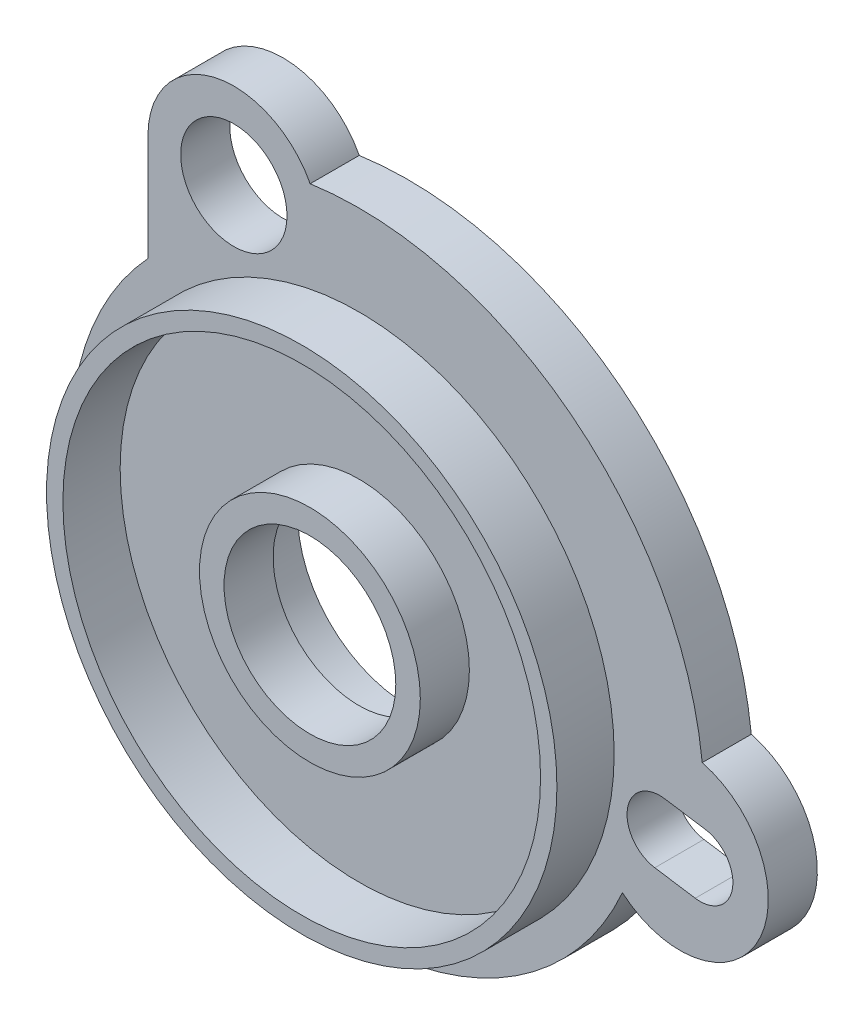
ISO-10303-21;
HEADER;
FILE_DESCRIPTION(('STEP AP214'),'2;1');
FILE_NAME('part.step','',(''),(''),'','','');
FILE_SCHEMA(('AUTOMOTIVE_DESIGN { 1 0 10303 214 1 1 1 1 }'));
ENDSEC;
DATA;
#1=APPLICATION_CONTEXT('core data for automotive mechanical design processes');
#2=APPLICATION_PROTOCOL_DEFINITION('international standard','automotive_design',2000,#1);
#3=PRODUCT_CONTEXT('',#1,'mechanical');
#4=PRODUCT('Part','Part','',(#3));
#5=PRODUCT_RELATED_PRODUCT_CATEGORY('part','',(#4));
#6=PRODUCT_DEFINITION_FORMATION('','',#4);
#7=PRODUCT_DEFINITION_CONTEXT('part definition',#1,'design');
#8=PRODUCT_DEFINITION('design','',#6,#7);
#9=PRODUCT_DEFINITION_SHAPE('','',#8);
#10=(LENGTH_UNIT() NAMED_UNIT(*) SI_UNIT(.MILLI.,.METRE.));
#11=(NAMED_UNIT(*) PLANE_ANGLE_UNIT() SI_UNIT($,.RADIAN.));
#12=(NAMED_UNIT(*) SI_UNIT($,.STERADIAN.) SOLID_ANGLE_UNIT());
#13=UNCERTAINTY_MEASURE_WITH_UNIT(LENGTH_MEASURE(1.E-05),#10,'distance_accuracy_value','');
#14=(GEOMETRIC_REPRESENTATION_CONTEXT(3) GLOBAL_UNCERTAINTY_ASSIGNED_CONTEXT((#13)) GLOBAL_UNIT_ASSIGNED_CONTEXT((#10,
#11,#12)) REPRESENTATION_CONTEXT('',''));
#15=CARTESIAN_POINT('',(0.,0.,0.));
#16=DIRECTION('',(0.,0.,1.));
#17=DIRECTION('',(1.,0.,0.));
#18=AXIS2_PLACEMENT_3D('',#15,#16,#17);
#19=CARTESIAN_POINT('',(18.3863485138619,-2.81108312342569,-3.));
#20=DIRECTION('',(0.,0.,1.));
#21=DIRECTION('',(1.,0.,0.));
#22=AXIS2_PLACEMENT_3D('',#19,#20,#21);
#23=CYLINDRICAL_SURFACE('',#22,2.);
#24=CARTESIAN_POINT('',(18.3863485138619,-2.81108312342569,0.));
#25=DIRECTION('',(0.,0.,1.));
#26=DIRECTION('',(1.,0.,0.));
#27=AXIS2_PLACEMENT_3D('',#24,#25,#26);
#28=CIRCLE('',#27,2.);
#29=CARTESIAN_POINT('',(18.6886155163808,-0.83405640150506,0.));
#30=VERTEX_POINT('',#29);
#31=CARTESIAN_POINT('',(18.084081511343,-4.78810984534632,0.));
#32=VERTEX_POINT('',#31);
#33=EDGE_CURVE('E175',#30,#32,#28,.T.);
#34=ORIENTED_EDGE('',*,*,#33,.T.);
#35=DIRECTION('',(0.,0.,1.));
#36=VECTOR('',#35,1.);
#37=CARTESIAN_POINT('',(18.084081511343,-4.78810984534632,-3.));
#38=LINE('',#37,#36);
#39=CARTESIAN_POINT('',(18.084081511343,-4.78810984534632,-3.));
#40=VERTEX_POINT('',#39);
#41=EDGE_CURVE('E12',#40,#32,#38,.T.);
#42=ORIENTED_EDGE('',*,*,#41,.F.);
#43=CARTESIAN_POINT('',(18.3863485138619,-2.81108312342569,-3.));
#44=DIRECTION('',(0.,0.,1.));
#45=DIRECTION('',(1.,0.,0.));
#46=AXIS2_PLACEMENT_3D('',#43,#44,#45);
#47=CIRCLE('',#46,2.);
#48=CARTESIAN_POINT('',(18.6886155163808,-0.83405640150506,-3.));
#49=VERTEX_POINT('',#48);
#50=EDGE_CURVE('E147',#49,#40,#47,.T.);
#51=ORIENTED_EDGE('',*,*,#50,.F.);
#52=DIRECTION('',(0.,0.,1.));
#53=VECTOR('',#52,1.);
#54=CARTESIAN_POINT('',(18.6886155163808,-0.83405640150506,-3.));
#55=LINE('',#54,#53);
#56=EDGE_CURVE('E143',#49,#30,#55,.T.);
#57=ORIENTED_EDGE('',*,*,#56,.T.);
#58=EDGE_LOOP('',(#34,#42,#51,#57));
#59=FACE_BOUND('',#58,.T.);
#60=ADVANCED_FACE('F50',(#59),#23,.F.);
#61=CARTESIAN_POINT('',(-0.302267002518891,-1.97702672192062,-3.));
#62=DIRECTION('',(-0.151133501259446,-0.988513360960317,0.));
#63=DIRECTION('',(0.988513360960317,-0.151133501259446,0.));
#64=AXIS2_PLACEMENT_3D('',#61,#62,#63);
#65=PLANE('',#64);
#66=DIRECTION('',(0.988513360960317,-0.151133501259446,0.));
#67=VECTOR('',#66,1.);
#68=CARTESIAN_POINT('',(-0.302267002518891,-1.97702672192062,0.));
#69=LINE('',#68,#67);
#70=CARTESIAN_POINT('',(20.5553649137438,-5.16594359849494,0.));
#71=VERTEX_POINT('',#70);
#72=EDGE_CURVE('E97',#32,#71,#69,.T.);
#73=ORIENTED_EDGE('',*,*,#72,.T.);
#74=DIRECTION('',(0.,0.,1.));
#75=VECTOR('',#74,1.);
#76=CARTESIAN_POINT('',(20.5553649137438,-5.16594359849494,-3.));
#77=LINE('',#76,#75);
#78=CARTESIAN_POINT('',(20.5553649137438,-5.16594359849494,-3.));
#79=VERTEX_POINT('',#78);
#80=EDGE_CURVE('E60',#79,#71,#77,.T.);
#81=ORIENTED_EDGE('',*,*,#80,.F.);
#82=DIRECTION('',(0.988513360960317,-0.151133501259446,0.));
#83=VECTOR('',#82,1.);
#84=CARTESIAN_POINT('',(-0.302267002518891,-1.97702672192062,-3.));
#85=LINE('',#84,#83);
#86=EDGE_CURVE('E68',#40,#79,#85,.T.);
#87=ORIENTED_EDGE('',*,*,#86,.F.);
#88=ORIENTED_EDGE('',*,*,#41,.T.);
#89=EDGE_LOOP('',(#73,#81,#87,#88));
#90=FACE_BOUND('',#89,.T.);
#91=ADVANCED_FACE('F249',(#90),#65,.F.);
#92=CARTESIAN_POINT('',(20.8576319162627,-3.18891687657431,-3.));
#93=DIRECTION('',(0.,0.,1.));
#94=DIRECTION('',(1.,0.,0.));
#95=AXIS2_PLACEMENT_3D('',#92,#93,#94);
#96=CYLINDRICAL_SURFACE('',#95,2.);
#97=CARTESIAN_POINT('',(20.8576319162627,-3.18891687657431,0.));
#98=DIRECTION('',(0.,0.,1.));
#99=DIRECTION('',(1.,0.,0.));
#100=AXIS2_PLACEMENT_3D('',#97,#98,#99);
#101=CIRCLE('',#100,2.);
#102=CARTESIAN_POINT('',(21.1598989187816,-1.21189015465367,0.));
#103=VERTEX_POINT('',#102);
#104=EDGE_CURVE('E139',#71,#103,#101,.T.);
#105=ORIENTED_EDGE('',*,*,#104,.T.);
#106=DIRECTION('',(0.,0.,1.));
#107=VECTOR('',#106,1.);
#108=CARTESIAN_POINT('',(21.1598989187816,-1.21189015465367,-3.));
#109=LINE('',#108,#107);
#110=CARTESIAN_POINT('',(21.1598989187816,-1.21189015465367,-3.));
#111=VERTEX_POINT('',#110);
#112=EDGE_CURVE('E137',#111,#103,#109,.T.);
#113=ORIENTED_EDGE('',*,*,#112,.F.);
#114=CARTESIAN_POINT('',(20.8576319162627,-3.18891687657431,-3.));
#115=DIRECTION('',(0.,0.,1.));
#116=DIRECTION('',(1.,0.,0.));
#117=AXIS2_PLACEMENT_3D('',#114,#115,#116);
#118=CIRCLE('',#117,2.);
#119=EDGE_CURVE('E128',#79,#111,#118,.T.);
#120=ORIENTED_EDGE('',*,*,#119,.F.);
#121=ORIENTED_EDGE('',*,*,#80,.T.);
#122=EDGE_LOOP('',(#105,#113,#120,#121));
#123=FACE_BOUND('',#122,.T.);
#124=ADVANCED_FACE('F138',(#123),#96,.F.);
#125=CARTESIAN_POINT('',(0.,0.,-3.));
#126=DIRECTION('',(0.,0.,1.));
#127=DIRECTION('',(1.,0.,0.));
#128=AXIS2_PLACEMENT_3D('',#125,#126,#127);
#129=CYLINDRICAL_SURFACE('',#128,17.6);
#130=CARTESIAN_POINT('',(0.,0.,0.));
#131=DIRECTION('',(0.,0.,1.));
#132=DIRECTION('',(1.,0.,0.));
#133=AXIS2_PLACEMENT_3D('',#130,#131,#132);
#134=CIRCLE('',#133,17.6);
#135=CARTESIAN_POINT('',(-12.9,11.9728860347036,0.));
#136=VERTEX_POINT('',#135);
#137=CARTESIAN_POINT('',(16.1052762288819,-7.09789247533454,0.));
#138=VERTEX_POINT('',#137);
#139=EDGE_CURVE('E157',#136,#138,#134,.T.);
#140=ORIENTED_EDGE('',*,*,#139,.F.);
#141=DIRECTION('',(0.,0.,1.));
#142=VECTOR('',#141,1.);
#143=CARTESIAN_POINT('',(-12.9,11.9728860347036,-3.));
#144=LINE('',#143,#142);
#145=CARTESIAN_POINT('',(-12.9,11.9728860347036,-3.));
#146=VERTEX_POINT('',#145);
#147=EDGE_CURVE('E188',#146,#136,#144,.T.);
#148=ORIENTED_EDGE('',*,*,#147,.F.);
#149=CARTESIAN_POINT('',(0.,0.,-3.));
#150=DIRECTION('',(0.,0.,1.));
#151=DIRECTION('',(1.,0.,0.));
#152=AXIS2_PLACEMENT_3D('',#149,#150,#151);
#153=CIRCLE('',#152,17.6);
#154=CARTESIAN_POINT('',(16.1052762288819,-7.09789247533454,-3.));
#155=VERTEX_POINT('',#154);
#156=EDGE_CURVE('E184',#146,#155,#153,.T.);
#157=ORIENTED_EDGE('',*,*,#156,.T.);
#158=DIRECTION('',(0.,0.,1.));
#159=VECTOR('',#158,1.);
#160=CARTESIAN_POINT('',(16.1052762288819,-7.09789247533454,-3.));
#161=LINE('',#160,#159);
#162=EDGE_CURVE('E54',#155,#138,#161,.T.);
#163=ORIENTED_EDGE('',*,*,#162,.T.);
#164=EDGE_LOOP('',(#140,#148,#157,#163));
#165=FACE_BOUND('',#164,.T.);
#166=ADVANCED_FACE('F52',(#165),#129,.T.);
#167=CARTESIAN_POINT('',(-12.9,0.,-3.));
#168=DIRECTION('',(1.,0.,0.));
#169=DIRECTION('',(0.,1.,0.));
#170=AXIS2_PLACEMENT_3D('',#167,#168,#169);
#171=PLANE('',#170);
#172=DIRECTION('',(0.,1.,0.));
#173=VECTOR('',#172,1.);
#174=CARTESIAN_POINT('',(-12.9,0.,0.));
#175=LINE('',#174,#173);
#176=CARTESIAN_POINT('',(-12.9,18.4791098270452,0.));
#177=VERTEX_POINT('',#176);
#178=EDGE_CURVE('E169',#136,#177,#175,.T.);
#179=ORIENTED_EDGE('',*,*,#178,.T.);
#180=DIRECTION('',(0.,0.,1.));
#181=VECTOR('',#180,1.);
#182=CARTESIAN_POINT('',(-12.9,18.4791098270452,-3.));
#183=LINE('',#182,#181);
#184=CARTESIAN_POINT('',(-12.9,18.4791098270452,-3.));
#185=VERTEX_POINT('',#184);
#186=EDGE_CURVE('E190',#185,#177,#183,.T.);
#187=ORIENTED_EDGE('',*,*,#186,.F.);
#188=DIRECTION('',(0.,1.,0.));
#189=VECTOR('',#188,1.);
#190=CARTESIAN_POINT('',(-12.9,0.,-3.));
#191=LINE('',#190,#189);
#192=EDGE_CURVE('E210',#146,#185,#191,.T.);
#193=ORIENTED_EDGE('',*,*,#192,.F.);
#194=ORIENTED_EDGE('',*,*,#147,.T.);
#195=EDGE_LOOP('',(#179,#187,#193,#194));
#196=FACE_BOUND('',#195,.T.);
#197=ADVANCED_FACE('F207',(#196),#171,.F.);
#198=CARTESIAN_POINT('',(-7.65,18.4791098270452,-3.));
#199=DIRECTION('',(0.,0.,1.));
#200=DIRECTION('',(1.,0.,0.));
#201=AXIS2_PLACEMENT_3D('',#198,#199,#200);
#202=CYLINDRICAL_SURFACE('',#201,5.25);
#203=CARTESIAN_POINT('',(-7.65,18.4791098270452,0.));
#204=DIRECTION('',(0.,0.,1.));
#205=DIRECTION('',(1.,0.,0.));
#206=AXIS2_PLACEMENT_3D('',#203,#204,#205);
#207=CIRCLE('',#206,5.25);
#208=CARTESIAN_POINT('',(-2.98514629499739,20.8877691867147,0.));
#209=VERTEX_POINT('',#208);
#210=EDGE_CURVE('E166',#209,#177,#207,.T.);
#211=ORIENTED_EDGE('',*,*,#210,.F.);
#212=DIRECTION('',(0.,0.,1.));
#213=VECTOR('',#212,1.);
#214=CARTESIAN_POINT('',(-2.98514629499739,20.8877691867147,-3.));
#215=LINE('',#214,#213);
#216=CARTESIAN_POINT('',(-2.98514629499739,20.8877691867147,-3.));
#217=VERTEX_POINT('',#216);
#218=EDGE_CURVE('E192',#217,#209,#215,.T.);
#219=ORIENTED_EDGE('',*,*,#218,.F.);
#220=CARTESIAN_POINT('',(-7.65,18.4791098270452,-3.));
#221=DIRECTION('',(0.,0.,1.));
#222=DIRECTION('',(1.,0.,0.));
#223=AXIS2_PLACEMENT_3D('',#220,#221,#222);
#224=CIRCLE('',#223,5.25);
#225=EDGE_CURVE('E213',#217,#185,#224,.T.);
#226=ORIENTED_EDGE('',*,*,#225,.T.);
#227=ORIENTED_EDGE('',*,*,#186,.T.);
#228=EDGE_LOOP('',(#211,#219,#226,#227));
#229=FACE_BOUND('',#228,.T.);
#230=ADVANCED_FACE('F260',(#229),#202,.T.);
#231=CARTESIAN_POINT('',(3.05311331771918E-13,1.80411241501588E-13,-3.));
#232=DIRECTION('',(0.,0.,1.));
#233=DIRECTION('',(1.,0.,0.));
#234=AXIS2_PLACEMENT_3D('',#231,#232,#233);
#235=CYLINDRICAL_SURFACE('',#234,21.1);
#236=CARTESIAN_POINT('',(3.05311331771918E-13,1.80411241501588E-13,0.));
#237=DIRECTION('',(0.,0.,1.));
#238=DIRECTION('',(1.,0.,0.));
#239=AXIS2_PLACEMENT_3D('',#236,#237,#238);
#240=CIRCLE('',#239,21.1);
#241=CARTESIAN_POINT('',(20.982267102422,2.22586325784697,0.));
#242=VERTEX_POINT('',#241);
#243=EDGE_CURVE('E163',#242,#209,#240,.T.);
#244=ORIENTED_EDGE('',*,*,#243,.F.);
#245=DIRECTION('',(0.,0.,1.));
#246=VECTOR('',#245,1.);
#247=CARTESIAN_POINT('',(20.982267102422,2.22586325784697,-3.));
#248=LINE('',#247,#246);
#249=CARTESIAN_POINT('',(20.982267102422,2.22586325784697,-3.));
#250=VERTEX_POINT('',#249);
#251=EDGE_CURVE('E193',#250,#242,#248,.T.);
#252=ORIENTED_EDGE('',*,*,#251,.F.);
#253=CARTESIAN_POINT('',(3.05311331771918E-13,1.80411241501588E-13,-3.));
#254=DIRECTION('',(0.,0.,1.));
#255=DIRECTION('',(1.,0.,0.));
#256=AXIS2_PLACEMENT_3D('',#253,#254,#255);
#257=CIRCLE('',#256,21.1);
#258=EDGE_CURVE('E219',#250,#217,#257,.T.);
#259=ORIENTED_EDGE('',*,*,#258,.T.);
#260=ORIENTED_EDGE('',*,*,#218,.T.);
#261=EDGE_LOOP('',(#244,#252,#259,#260));
#262=FACE_BOUND('',#261,.T.);
#263=ADVANCED_FACE('F263',(#262),#235,.T.);
#264=CARTESIAN_POINT('',(0.302267002518889,1.97702672192062,-3.));
#265=DIRECTION('',(-0.151133501259445,-0.988513360960317,0.));
#266=DIRECTION('',(0.988513360960317,-0.151133501259445,0.));
#267=AXIS2_PLACEMENT_3D('',#264,#265,#266);
#268=PLANE('',#267);
#269=DIRECTION('',(0.988513360960317,-0.151133501259445,0.));
#270=VECTOR('',#269,1.);
#271=CARTESIAN_POINT('',(0.302267002518889,1.97702672192062,0.));
#272=LINE('',#271,#270);
#273=EDGE_CURVE('E178',#30,#103,#272,.T.);
#274=ORIENTED_EDGE('',*,*,#273,.F.);
#275=ORIENTED_EDGE('',*,*,#56,.F.);
#276=DIRECTION('',(0.988513360960317,-0.151133501259445,0.));
#277=VECTOR('',#276,1.);
#278=CARTESIAN_POINT('',(0.302267002518889,1.97702672192062,-3.));
#279=LINE('',#278,#277);
#280=EDGE_CURVE('E133',#49,#111,#279,.T.);
#281=ORIENTED_EDGE('',*,*,#280,.T.);
#282=ORIENTED_EDGE('',*,*,#112,.T.);
#283=EDGE_LOOP('',(#274,#275,#281,#282));
#284=FACE_BOUND('',#283,.T.);
#285=ADVANCED_FACE('F145',(#284),#268,.T.);
#286=CARTESIAN_POINT('',(-7.65,18.4791098270452,-3.));
#287=DIRECTION('',(0.,0.,1.));
#288=DIRECTION('',(1.,0.,0.));
#289=AXIS2_PLACEMENT_3D('',#286,#287,#288);
#290=CYLINDRICAL_SURFACE('',#289,3.25);
#291=CARTESIAN_POINT('',(-7.65,18.4791098270452,-3.));
#292=DIRECTION('',(0.,0.,1.));
#293=DIRECTION('',(1.,0.,0.));
#294=AXIS2_PLACEMENT_3D('',#291,#292,#293);
#295=CIRCLE('',#294,3.25);
#296=CARTESIAN_POINT('',(-4.4,18.4791098270452,-3.));
#297=VERTEX_POINT('',#296);
#298=EDGE_CURVE('E149',#297,#297,#295,.T.);
#299=ORIENTED_EDGE('',*,*,#298,.F.);
#300=EDGE_LOOP('',(#299));
#301=FACE_BOUND('',#300,.T.);
#302=CARTESIAN_POINT('',(-7.65,18.4791098270452,0.));
#303=DIRECTION('',(0.,0.,1.));
#304=DIRECTION('',(1.,0.,0.));
#305=AXIS2_PLACEMENT_3D('',#302,#303,#304);
#306=CIRCLE('',#305,3.25);
#307=CARTESIAN_POINT('',(-4.4,18.4791098270452,0.));
#308=VERTEX_POINT('',#307);
#309=EDGE_CURVE('E172',#308,#308,#306,.T.);
#310=ORIENTED_EDGE('',*,*,#309,.T.);
#311=EDGE_LOOP('',(#310));
#312=FACE_BOUND('',#311,.T.);
#313=ADVANCED_FACE('F227',(#301,#312),#290,.F.);
#314=CARTESIAN_POINT('',(19.6219902150623,-3.,-3.));
#315=DIRECTION('',(0.,0.,1.));
#316=DIRECTION('',(1.,0.,0.));
#317=AXIS2_PLACEMENT_3D('',#314,#315,#316);
#318=CYLINDRICAL_SURFACE('',#317,5.4);
#319=CARTESIAN_POINT('',(19.6219902150623,-3.,0.));
#320=DIRECTION('',(0.,0.,1.));
#321=DIRECTION('',(1.,0.,0.));
#322=AXIS2_PLACEMENT_3D('',#319,#320,#321);
#323=CIRCLE('',#322,5.4);
#324=EDGE_CURVE('E160',#138,#242,#323,.T.);
#325=ORIENTED_EDGE('',*,*,#324,.F.);
#326=ORIENTED_EDGE('',*,*,#162,.F.);
#327=CARTESIAN_POINT('',(19.6219902150623,-3.,-3.));
#328=DIRECTION('',(0.,0.,1.));
#329=DIRECTION('',(1.,0.,0.));
#330=AXIS2_PLACEMENT_3D('',#327,#328,#329);
#331=CIRCLE('',#330,5.4);
#332=EDGE_CURVE('E217',#155,#250,#331,.T.);
#333=ORIENTED_EDGE('',*,*,#332,.T.);
#334=ORIENTED_EDGE('',*,*,#251,.T.);
#335=EDGE_LOOP('',(#325,#326,#333,#334));
#336=FACE_BOUND('',#335,.T.);
#337=ADVANCED_FACE('F199',(#336),#318,.T.);
#338=CARTESIAN_POINT('',(0.,0.,-3.));
#339=DIRECTION('',(0.,0.,1.));
#340=DIRECTION('',(1.,0.,0.));
#341=AXIS2_PLACEMENT_3D('',#338,#339,#340);
#342=CYLINDRICAL_SURFACE('',#341,6.75);
#343=CARTESIAN_POINT('',(0.,0.,-3.));
#344=DIRECTION('',(0.,0.,1.));
#345=DIRECTION('',(1.,0.,0.));
#346=AXIS2_PLACEMENT_3D('',#343,#344,#345);
#347=CIRCLE('',#346,6.75);
#348=CARTESIAN_POINT('',(6.75,0.,-3.));
#349=VERTEX_POINT('',#348);
#350=EDGE_CURVE('E154',#349,#349,#347,.T.);
#351=ORIENTED_EDGE('',*,*,#350,.F.);
#352=EDGE_LOOP('',(#351));
#353=FACE_BOUND('',#352,.T.);
#354=CARTESIAN_POINT('',(0.,0.,0.));
#355=DIRECTION('',(0.,0.,1.));
#356=DIRECTION('',(1.,0.,0.));
#357=AXIS2_PLACEMENT_3D('',#354,#355,#356);
#358=CIRCLE('',#357,6.75);
#359=CARTESIAN_POINT('',(6.75,0.,0.));
#360=VERTEX_POINT('',#359);
#361=EDGE_CURVE('E182',#360,#360,#358,.T.);
#362=ORIENTED_EDGE('',*,*,#361,.T.);
#363=EDGE_LOOP('',(#362));
#364=FACE_BOUND('',#363,.T.);
#365=ADVANCED_FACE('F237',(#353,#364),#342,.F.);
#366=CARTESIAN_POINT('',(0.,0.,-3.));
#367=DIRECTION('',(0.,0.,1.));
#368=DIRECTION('',(1.,0.,0.));
#369=AXIS2_PLACEMENT_3D('',#366,#367,#368);
#370=PLANE('',#369);
#371=ORIENTED_EDGE('',*,*,#156,.F.);
#372=ORIENTED_EDGE('',*,*,#192,.T.);
#373=ORIENTED_EDGE('',*,*,#225,.F.);
#374=ORIENTED_EDGE('',*,*,#258,.F.);
#375=ORIENTED_EDGE('',*,*,#332,.F.);
#376=EDGE_LOOP('',(#371,#372,#373,#374,#375));
#377=FACE_BOUND('',#376,.T.);
#378=ORIENTED_EDGE('',*,*,#298,.T.);
#379=EDGE_LOOP('',(#378));
#380=FACE_BOUND('',#379,.T.);
#381=ORIENTED_EDGE('',*,*,#50,.T.);
#382=ORIENTED_EDGE('',*,*,#86,.T.);
#383=ORIENTED_EDGE('',*,*,#119,.T.);
#384=ORIENTED_EDGE('',*,*,#280,.F.);
#385=EDGE_LOOP('',(#381,#382,#383,#384));
#386=FACE_BOUND('',#385,.T.);
#387=ORIENTED_EDGE('',*,*,#350,.T.);
#388=EDGE_LOOP('',(#387));
#389=FACE_BOUND('',#388,.T.);
#390=ADVANCED_FACE('F130',(#377,#380,#386,#389),#370,.F.);
#391=CARTESIAN_POINT('',(0.,0.,0.));
#392=DIRECTION('',(0.,0.,1.));
#393=DIRECTION('',(1.,0.,0.));
#394=AXIS2_PLACEMENT_3D('',#391,#392,#393);
#395=PLANE('',#394);
#396=ORIENTED_EDGE('',*,*,#139,.T.);
#397=ORIENTED_EDGE('',*,*,#324,.T.);
#398=ORIENTED_EDGE('',*,*,#243,.T.);
#399=ORIENTED_EDGE('',*,*,#210,.T.);
#400=ORIENTED_EDGE('',*,*,#178,.F.);
#401=EDGE_LOOP('',(#396,#397,#398,#399,#400));
#402=FACE_BOUND('',#401,.T.);
#403=ORIENTED_EDGE('',*,*,#309,.F.);
#404=EDGE_LOOP('',(#403));
#405=FACE_BOUND('',#404,.T.);
#406=ORIENTED_EDGE('',*,*,#33,.F.);
#407=ORIENTED_EDGE('',*,*,#273,.T.);
#408=ORIENTED_EDGE('',*,*,#104,.F.);
#409=ORIENTED_EDGE('',*,*,#72,.F.);
#410=EDGE_LOOP('',(#406,#407,#408,#409));
#411=FACE_BOUND('',#410,.T.);
#412=ORIENTED_EDGE('',*,*,#361,.F.);
#413=EDGE_LOOP('',(#412));
#414=FACE_BOUND('',#413,.T.);
#415=ADVANCED_FACE('F202',(#402,#405,#411,#414),#395,.T.);
#416=CLOSED_SHELL('',(#60,#91,#124,#166,#197,#230,#263,#285,#313,#337,#365,#390,#415));
#417=MANIFOLD_SOLID_BREP('B2',#416);
#418=CARTESIAN_POINT('',(0.,0.,3.));
#419=DIRECTION('',(0.,0.,-1.));
#420=DIRECTION('',(-1.,0.,0.));
#421=AXIS2_PLACEMENT_3D('',#418,#419,#420);
#422=CYLINDRICAL_SURFACE('',#421,5.25);
#423=CARTESIAN_POINT('',(0.,0.,3.));
#424=DIRECTION('',(0.,0.,1.));
#425=DIRECTION('',(1.,0.,0.));
#426=AXIS2_PLACEMENT_3D('',#423,#424,#425);
#427=CIRCLE('',#426,5.25);
#428=CARTESIAN_POINT('',(5.25,0.,3.));
#429=VERTEX_POINT('',#428);
#430=EDGE_CURVE('E376',#429,#429,#427,.T.);
#431=ORIENTED_EDGE('',*,*,#430,.T.);
#432=EDGE_LOOP('',(#431));
#433=FACE_BOUND('',#432,.T.);
#434=CARTESIAN_POINT('',(0.,0.,0.));
#435=DIRECTION('',(0.,0.,1.));
#436=DIRECTION('',(1.,0.,0.));
#437=AXIS2_PLACEMENT_3D('',#434,#435,#436);
#438=CIRCLE('',#437,5.25);
#439=CARTESIAN_POINT('',(5.25,0.,0.));
#440=VERTEX_POINT('',#439);
#441=EDGE_CURVE('E382',#440,#440,#438,.T.);
#442=ORIENTED_EDGE('',*,*,#441,.F.);
#443=EDGE_LOOP('',(#442));
#444=FACE_BOUND('',#443,.T.);
#445=ADVANCED_FACE('F369',(#433,#444),#422,.F.);
#446=CARTESIAN_POINT('',(0.,0.,3.));
#447=DIRECTION('',(0.,0.,-1.));
#448=DIRECTION('',(-1.,0.,0.));
#449=AXIS2_PLACEMENT_3D('',#446,#447,#448);
#450=CYLINDRICAL_SURFACE('',#449,6.75);
#451=CARTESIAN_POINT('',(0.,0.,3.));
#452=DIRECTION('',(0.,0.,1.));
#453=DIRECTION('',(1.,0.,0.));
#454=AXIS2_PLACEMENT_3D('',#451,#452,#453);
#455=CIRCLE('',#454,6.75);
#456=CARTESIAN_POINT('',(6.75,0.,3.));
#457=VERTEX_POINT('',#456);
#458=EDGE_CURVE('E49',#457,#457,#455,.T.);
#459=ORIENTED_EDGE('',*,*,#458,.F.);
#460=EDGE_LOOP('',(#459));
#461=FACE_BOUND('',#460,.T.);
#462=CARTESIAN_POINT('',(0.,0.,0.));
#463=DIRECTION('',(0.,0.,1.));
#464=DIRECTION('',(1.,0.,0.));
#465=AXIS2_PLACEMENT_3D('',#462,#463,#464);
#466=CIRCLE('',#465,6.75);
#467=CARTESIAN_POINT('',(6.75,0.,0.));
#468=VERTEX_POINT('',#467);
#469=EDGE_CURVE('E372',#468,#468,#466,.T.);
#470=ORIENTED_EDGE('',*,*,#469,.T.);
#471=EDGE_LOOP('',(#470));
#472=FACE_BOUND('',#471,.T.);
#473=ADVANCED_FACE('F389',(#461,#472),#450,.T.);
#474=CARTESIAN_POINT('',(0.,0.,3.));
#475=DIRECTION('',(0.,0.,1.));
#476=DIRECTION('',(1.,0.,0.));
#477=AXIS2_PLACEMENT_3D('',#474,#475,#476);
#478=PLANE('',#477);
#479=ORIENTED_EDGE('',*,*,#430,.F.);
#480=EDGE_LOOP('',(#479));
#481=FACE_BOUND('',#480,.T.);
#482=ORIENTED_EDGE('',*,*,#458,.T.);
#483=EDGE_LOOP('',(#482));
#484=FACE_BOUND('',#483,.T.);
#485=ADVANCED_FACE('F393',(#481,#484),#478,.T.);
#486=CARTESIAN_POINT('',(0.,0.,0.));
#487=DIRECTION('',(0.,0.,1.));
#488=DIRECTION('',(1.,0.,0.));
#489=AXIS2_PLACEMENT_3D('',#486,#487,#488);
#490=PLANE('',#489);
#491=ORIENTED_EDGE('',*,*,#441,.T.);
#492=EDGE_LOOP('',(#491));
#493=FACE_BOUND('',#492,.T.);
#494=ORIENTED_EDGE('',*,*,#469,.F.);
#495=EDGE_LOOP('',(#494));
#496=FACE_BOUND('',#495,.T.);
#497=ADVANCED_FACE('F391',(#493,#496),#490,.F.);
#498=CLOSED_SHELL('',(#445,#473,#485,#497));
#499=MANIFOLD_SOLID_BREP('B6',#498);
#500=CARTESIAN_POINT('',(0.,0.,3.5));
#501=DIRECTION('',(0.,0.,-1.));
#502=DIRECTION('',(-1.,0.,0.));
#503=AXIS2_PLACEMENT_3D('',#500,#501,#502);
#504=CYLINDRICAL_SURFACE('',#503,14.6);
#505=CARTESIAN_POINT('',(0.,0.,3.5));
#506=DIRECTION('',(0.,0.,1.));
#507=DIRECTION('',(1.,0.,0.));
#508=AXIS2_PLACEMENT_3D('',#505,#506,#507);
#509=CIRCLE('',#508,14.6);
#510=CARTESIAN_POINT('',(14.6,0.,3.5));
#511=VERTEX_POINT('',#510);
#512=EDGE_CURVE('E440',#511,#511,#509,.T.);
#513=ORIENTED_EDGE('',*,*,#512,.T.);
#514=EDGE_LOOP('',(#513));
#515=FACE_BOUND('',#514,.T.);
#516=CARTESIAN_POINT('',(0.,0.,0.));
#517=DIRECTION('',(0.,0.,1.));
#518=DIRECTION('',(1.,0.,0.));
#519=AXIS2_PLACEMENT_3D('',#516,#517,#518);
#520=CIRCLE('',#519,14.6);
#521=CARTESIAN_POINT('',(14.6,0.,0.));
#522=VERTEX_POINT('',#521);
#523=EDGE_CURVE('E446',#522,#522,#520,.T.);
#524=ORIENTED_EDGE('',*,*,#523,.F.);
#525=EDGE_LOOP('',(#524));
#526=FACE_BOUND('',#525,.T.);
#527=ADVANCED_FACE('F433',(#515,#526),#504,.F.);
#528=CARTESIAN_POINT('',(0.,0.,3.5));
#529=DIRECTION('',(0.,0.,-1.));
#530=DIRECTION('',(-1.,0.,0.));
#531=AXIS2_PLACEMENT_3D('',#528,#529,#530);
#532=CYLINDRICAL_SURFACE('',#531,15.6);
#533=CARTESIAN_POINT('',(0.,0.,3.5));
#534=DIRECTION('',(0.,0.,1.));
#535=DIRECTION('',(1.,0.,0.));
#536=AXIS2_PLACEMENT_3D('',#533,#534,#535);
#537=CIRCLE('',#536,15.6);
#538=CARTESIAN_POINT('',(15.6,0.,3.5));
#539=VERTEX_POINT('',#538);
#540=EDGE_CURVE('E368',#539,#539,#537,.T.);
#541=ORIENTED_EDGE('',*,*,#540,.F.);
#542=EDGE_LOOP('',(#541));
#543=FACE_BOUND('',#542,.T.);
#544=CARTESIAN_POINT('',(0.,0.,0.));
#545=DIRECTION('',(0.,0.,1.));
#546=DIRECTION('',(1.,0.,0.));
#547=AXIS2_PLACEMENT_3D('',#544,#545,#546);
#548=CIRCLE('',#547,15.6);
#549=CARTESIAN_POINT('',(15.6,0.,0.));
#550=VERTEX_POINT('',#549);
#551=EDGE_CURVE('E436',#550,#550,#548,.T.);
#552=ORIENTED_EDGE('',*,*,#551,.T.);
#553=EDGE_LOOP('',(#552));
#554=FACE_BOUND('',#553,.T.);
#555=ADVANCED_FACE('F453',(#543,#554),#532,.T.);
#556=CARTESIAN_POINT('',(0.,0.,3.5));
#557=DIRECTION('',(0.,0.,1.));
#558=DIRECTION('',(1.,0.,0.));
#559=AXIS2_PLACEMENT_3D('',#556,#557,#558);
#560=PLANE('',#559);
#561=ORIENTED_EDGE('',*,*,#512,.F.);
#562=EDGE_LOOP('',(#561));
#563=FACE_BOUND('',#562,.T.);
#564=ORIENTED_EDGE('',*,*,#540,.T.);
#565=EDGE_LOOP('',(#564));
#566=FACE_BOUND('',#565,.T.);
#567=ADVANCED_FACE('F457',(#563,#566),#560,.T.);
#568=CARTESIAN_POINT('',(0.,0.,0.));
#569=DIRECTION('',(0.,0.,1.));
#570=DIRECTION('',(1.,0.,0.));
#571=AXIS2_PLACEMENT_3D('',#568,#569,#570);
#572=PLANE('',#571);
#573=ORIENTED_EDGE('',*,*,#523,.T.);
#574=EDGE_LOOP('',(#573));
#575=FACE_BOUND('',#574,.T.);
#576=ORIENTED_EDGE('',*,*,#551,.F.);
#577=EDGE_LOOP('',(#576));
#578=FACE_BOUND('',#577,.T.);
#579=ADVANCED_FACE('F455',(#575,#578),#572,.F.);
#580=CLOSED_SHELL('',(#527,#555,#567,#579));
#581=MANIFOLD_SOLID_BREP('B44',#580);
#582=ADVANCED_BREP_SHAPE_REPRESENTATION('',(#18,#417,#499,#581),#14);
#583=SHAPE_DEFINITION_REPRESENTATION(#9,#582);
ENDSEC;
END-ISO-10303-21;
